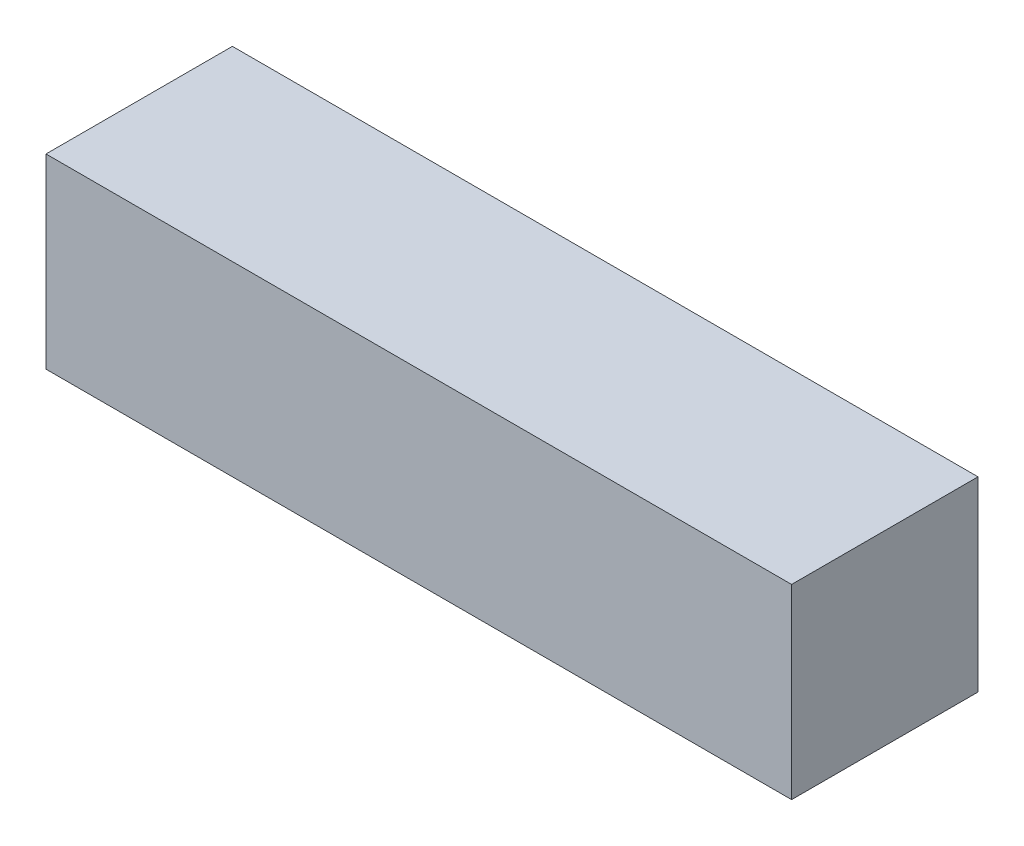
ISO-10303-21;
HEADER;
FILE_DESCRIPTION(('STEP AP214'),'2;1');
FILE_NAME('part.step','',(''),(''),'','','');
FILE_SCHEMA(('AUTOMOTIVE_DESIGN { 1 0 10303 214 1 1 1 1 }'));
ENDSEC;
DATA;
#1=APPLICATION_CONTEXT('core data for automotive mechanical design processes');
#2=APPLICATION_PROTOCOL_DEFINITION('international standard','automotive_design',2000,#1);
#3=PRODUCT_CONTEXT('',#1,'mechanical');
#4=PRODUCT('Part','Part','',(#3));
#5=PRODUCT_RELATED_PRODUCT_CATEGORY('part','',(#4));
#6=PRODUCT_DEFINITION_FORMATION('','',#4);
#7=PRODUCT_DEFINITION_CONTEXT('part definition',#1,'design');
#8=PRODUCT_DEFINITION('design','',#6,#7);
#9=PRODUCT_DEFINITION_SHAPE('','',#8);
#10=(LENGTH_UNIT() NAMED_UNIT(*) SI_UNIT(.MILLI.,.METRE.));
#11=(NAMED_UNIT(*) PLANE_ANGLE_UNIT() SI_UNIT($,.RADIAN.));
#12=(NAMED_UNIT(*) SI_UNIT($,.STERADIAN.) SOLID_ANGLE_UNIT());
#13=UNCERTAINTY_MEASURE_WITH_UNIT(LENGTH_MEASURE(1.E-05),#10,'distance_accuracy_value','');
#14=(GEOMETRIC_REPRESENTATION_CONTEXT(3) GLOBAL_UNCERTAINTY_ASSIGNED_CONTEXT((#13)) GLOBAL_UNIT_ASSIGNED_CONTEXT((#10,
#11,#12)) REPRESENTATION_CONTEXT('',''));
#15=CARTESIAN_POINT('',(0.,0.,0.));
#16=DIRECTION('',(0.,0.,1.));
#17=DIRECTION('',(1.,0.,0.));
#18=AXIS2_PLACEMENT_3D('',#15,#16,#17);
#19=CARTESIAN_POINT('',(10.,5.,-2.5));
#20=DIRECTION('',(-1.,0.,0.));
#21=DIRECTION('',(0.,0.,1.));
#22=AXIS2_PLACEMENT_3D('',#19,#20,#21);
#23=PLANE('',#22);
#24=DIRECTION('',(0.,0.,-1.));
#25=VECTOR('',#24,1.);
#26=CARTESIAN_POINT('',(10.,0.,-2.5));
#27=LINE('',#26,#25);
#28=CARTESIAN_POINT('',(10.,0.,2.5));
#29=VERTEX_POINT('',#28);
#30=CARTESIAN_POINT('',(10.,0.,-2.5));
#31=VERTEX_POINT('',#30);
#32=EDGE_CURVE('E107',#29,#31,#27,.T.);
#33=ORIENTED_EDGE('',*,*,#32,.T.);
#34=DIRECTION('',(0.,-1.,0.));
#35=VECTOR('',#34,1.);
#36=CARTESIAN_POINT('',(10.,5.,-2.5));
#37=LINE('',#36,#35);
#38=CARTESIAN_POINT('',(10.,5.,-2.5));
#39=VERTEX_POINT('',#38);
#40=EDGE_CURVE('E11',#39,#31,#37,.T.);
#41=ORIENTED_EDGE('',*,*,#40,.F.);
#42=DIRECTION('',(0.,0.,-1.));
#43=VECTOR('',#42,1.);
#44=CARTESIAN_POINT('',(10.,5.,-2.5));
#45=LINE('',#44,#43);
#46=CARTESIAN_POINT('',(10.,5.,2.5));
#47=VERTEX_POINT('',#46);
#48=EDGE_CURVE('E91',#47,#39,#45,.T.);
#49=ORIENTED_EDGE('',*,*,#48,.F.);
#50=DIRECTION('',(0.,-1.,0.));
#51=VECTOR('',#50,1.);
#52=CARTESIAN_POINT('',(10.,5.,2.5));
#53=LINE('',#52,#51);
#54=EDGE_CURVE('E103',#47,#29,#53,.T.);
#55=ORIENTED_EDGE('',*,*,#54,.T.);
#56=EDGE_LOOP('',(#33,#41,#49,#55));
#57=FACE_BOUND('',#56,.T.);
#58=ADVANCED_FACE('F39',(#57),#23,.F.);
#59=CARTESIAN_POINT('',(-10.,5.,-2.5));
#60=DIRECTION('',(0.,0.,1.));
#61=DIRECTION('',(1.,0.,0.));
#62=AXIS2_PLACEMENT_3D('',#59,#60,#61);
#63=PLANE('',#62);
#64=DIRECTION('',(-1.,0.,0.));
#65=VECTOR('',#64,1.);
#66=CARTESIAN_POINT('',(-10.,0.,-2.5));
#67=LINE('',#66,#65);
#68=CARTESIAN_POINT('',(-10.,0.,-2.5));
#69=VERTEX_POINT('',#68);
#70=EDGE_CURVE('E96',#31,#69,#67,.T.);
#71=ORIENTED_EDGE('',*,*,#70,.T.);
#72=DIRECTION('',(0.,-1.,0.));
#73=VECTOR('',#72,1.);
#74=CARTESIAN_POINT('',(-10.,5.,-2.5));
#75=LINE('',#74,#73);
#76=CARTESIAN_POINT('',(-10.,5.,-2.5));
#77=VERTEX_POINT('',#76);
#78=EDGE_CURVE('E48',#77,#69,#75,.T.);
#79=ORIENTED_EDGE('',*,*,#78,.F.);
#80=DIRECTION('',(-1.,0.,0.));
#81=VECTOR('',#80,1.);
#82=CARTESIAN_POINT('',(-10.,5.,-2.5));
#83=LINE('',#82,#81);
#84=EDGE_CURVE('E86',#39,#77,#83,.T.);
#85=ORIENTED_EDGE('',*,*,#84,.F.);
#86=ORIENTED_EDGE('',*,*,#40,.T.);
#87=EDGE_LOOP('',(#71,#79,#85,#86));
#88=FACE_BOUND('',#87,.T.);
#89=ADVANCED_FACE('F95',(#88),#63,.F.);
#90=CARTESIAN_POINT('',(-10.,5.,-2.5));
#91=DIRECTION('',(1.,0.,0.));
#92=DIRECTION('',(0.,0.,-1.));
#93=AXIS2_PLACEMENT_3D('',#90,#91,#92);
#94=PLANE('',#93);
#95=DIRECTION('',(0.,0.,1.));
#96=VECTOR('',#95,1.);
#97=CARTESIAN_POINT('',(-10.,0.,-2.5));
#98=LINE('',#97,#96);
#99=CARTESIAN_POINT('',(-10.,0.,2.5));
#100=VERTEX_POINT('',#99);
#101=EDGE_CURVE('E73',#69,#100,#98,.T.);
#102=ORIENTED_EDGE('',*,*,#101,.T.);
#103=DIRECTION('',(0.,-1.,0.));
#104=VECTOR('',#103,1.);
#105=CARTESIAN_POINT('',(-10.,5.,2.5));
#106=LINE('',#105,#104);
#107=CARTESIAN_POINT('',(-10.,5.,2.5));
#108=VERTEX_POINT('',#107);
#109=EDGE_CURVE('E98',#108,#100,#106,.T.);
#110=ORIENTED_EDGE('',*,*,#109,.F.);
#111=DIRECTION('',(0.,0.,1.));
#112=VECTOR('',#111,1.);
#113=CARTESIAN_POINT('',(-10.,5.,-2.5));
#114=LINE('',#113,#112);
#115=EDGE_CURVE('E89',#77,#108,#114,.T.);
#116=ORIENTED_EDGE('',*,*,#115,.F.);
#117=ORIENTED_EDGE('',*,*,#78,.T.);
#118=EDGE_LOOP('',(#102,#110,#116,#117));
#119=FACE_BOUND('',#118,.T.);
#120=ADVANCED_FACE('F99',(#119),#94,.F.);
#121=CARTESIAN_POINT('',(-10.,5.,2.5));
#122=DIRECTION('',(0.,0.,-1.));
#123=DIRECTION('',(-1.,0.,0.));
#124=AXIS2_PLACEMENT_3D('',#121,#122,#123);
#125=PLANE('',#124);
#126=DIRECTION('',(1.,0.,0.));
#127=VECTOR('',#126,1.);
#128=CARTESIAN_POINT('',(-10.,0.,2.5));
#129=LINE('',#128,#127);
#130=EDGE_CURVE('E79',#100,#29,#129,.T.);
#131=ORIENTED_EDGE('',*,*,#130,.T.);
#132=ORIENTED_EDGE('',*,*,#54,.F.);
#133=DIRECTION('',(1.,0.,0.));
#134=VECTOR('',#133,1.);
#135=CARTESIAN_POINT('',(-10.,5.,2.5));
#136=LINE('',#135,#134);
#137=EDGE_CURVE('E56',#108,#47,#136,.T.);
#138=ORIENTED_EDGE('',*,*,#137,.F.);
#139=ORIENTED_EDGE('',*,*,#109,.T.);
#140=EDGE_LOOP('',(#131,#132,#138,#139));
#141=FACE_BOUND('',#140,.T.);
#142=ADVANCED_FACE('F120',(#141),#125,.F.);
#143=CARTESIAN_POINT('',(0.,5.,0.));
#144=DIRECTION('',(0.,1.,0.));
#145=DIRECTION('',(0.,0.,1.));
#146=AXIS2_PLACEMENT_3D('',#143,#144,#145);
#147=PLANE('',#146);
#148=ORIENTED_EDGE('',*,*,#48,.T.);
#149=ORIENTED_EDGE('',*,*,#84,.T.);
#150=ORIENTED_EDGE('',*,*,#115,.T.);
#151=ORIENTED_EDGE('',*,*,#137,.T.);
#152=EDGE_LOOP('',(#148,#149,#150,#151));
#153=FACE_BOUND('',#152,.T.);
#154=ADVANCED_FACE('F87',(#153),#147,.T.);
#155=CARTESIAN_POINT('',(0.,0.,0.));
#156=DIRECTION('',(0.,1.,0.));
#157=DIRECTION('',(0.,0.,1.));
#158=AXIS2_PLACEMENT_3D('',#155,#156,#157);
#159=PLANE('',#158);
#160=ORIENTED_EDGE('',*,*,#32,.F.);
#161=ORIENTED_EDGE('',*,*,#130,.F.);
#162=ORIENTED_EDGE('',*,*,#101,.F.);
#163=ORIENTED_EDGE('',*,*,#70,.F.);
#164=EDGE_LOOP('',(#160,#161,#162,#163));
#165=FACE_BOUND('',#164,.T.);
#166=ADVANCED_FACE('F123',(#165),#159,.F.);
#167=CLOSED_SHELL('',(#58,#89,#120,#142,#154,#166));
#168=MANIFOLD_SOLID_BREP('B2',#167);
#169=ADVANCED_BREP_SHAPE_REPRESENTATION('',(#18,#168),#14);
#170=SHAPE_DEFINITION_REPRESENTATION(#9,#169);
ENDSEC;
END-ISO-10303-21;
